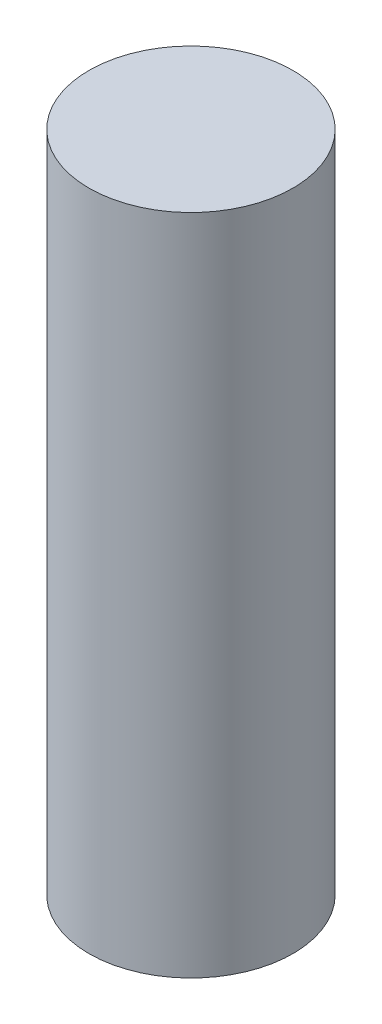
ISO-10303-21;
HEADER;
FILE_DESCRIPTION(('STEP AP214'),'2;1');
FILE_NAME('part.step','',(''),(''),'','','');
FILE_SCHEMA(('AUTOMOTIVE_DESIGN { 1 0 10303 214 1 1 1 1 }'));
ENDSEC;
DATA;
#1=APPLICATION_CONTEXT('core data for automotive mechanical design processes');
#2=APPLICATION_PROTOCOL_DEFINITION('international standard','automotive_design',2000,#1);
#3=PRODUCT_CONTEXT('',#1,'mechanical');
#4=PRODUCT('Part','Part','',(#3));
#5=PRODUCT_RELATED_PRODUCT_CATEGORY('part','',(#4));
#6=PRODUCT_DEFINITION_FORMATION('','',#4);
#7=PRODUCT_DEFINITION_CONTEXT('part definition',#1,'design');
#8=PRODUCT_DEFINITION('design','',#6,#7);
#9=PRODUCT_DEFINITION_SHAPE('','',#8);
#10=(LENGTH_UNIT() NAMED_UNIT(*) SI_UNIT(.MILLI.,.METRE.));
#11=(NAMED_UNIT(*) PLANE_ANGLE_UNIT() SI_UNIT($,.RADIAN.));
#12=(NAMED_UNIT(*) SI_UNIT($,.STERADIAN.) SOLID_ANGLE_UNIT());
#13=UNCERTAINTY_MEASURE_WITH_UNIT(LENGTH_MEASURE(1.E-05),#10,'distance_accuracy_value','');
#14=(GEOMETRIC_REPRESENTATION_CONTEXT(3) GLOBAL_UNCERTAINTY_ASSIGNED_CONTEXT((#13)) GLOBAL_UNIT_ASSIGNED_CONTEXT((#10,
#11,#12)) REPRESENTATION_CONTEXT('',''));
#15=CARTESIAN_POINT('',(0.,0.,0.));
#16=DIRECTION('',(0.,0.,1.));
#17=DIRECTION('',(1.,0.,0.));
#18=AXIS2_PLACEMENT_3D('',#15,#16,#17);
#19=CARTESIAN_POINT('',(0.,284.375,0.));
#20=DIRECTION('',(0.,-1.,0.));
#21=DIRECTION('',(0.,0.,-1.));
#22=AXIS2_PLACEMENT_3D('',#19,#20,#21);
#23=CYLINDRICAL_SURFACE('',#22,37.5);
#24=CARTESIAN_POINT('',(0.,284.375,0.));
#25=DIRECTION('',(0.,1.,0.));
#26=DIRECTION('',(0.,0.,1.));
#27=AXIS2_PLACEMENT_3D('',#24,#25,#26);
#28=CIRCLE('',#27,37.5);
#29=CARTESIAN_POINT('',(0.,284.375,37.5));
#30=VERTEX_POINT('',#29);
#31=EDGE_CURVE('E11',#30,#30,#28,.T.);
#32=ORIENTED_EDGE('',*,*,#31,.F.);
#33=EDGE_LOOP('',(#32));
#34=FACE_BOUND('',#33,.T.);
#35=CARTESIAN_POINT('',(0.,40.625,0.));
#36=DIRECTION('',(0.,1.,0.));
#37=DIRECTION('',(0.,0.,1.));
#38=AXIS2_PLACEMENT_3D('',#35,#36,#37);
#39=CIRCLE('',#38,37.5);
#40=CARTESIAN_POINT('',(0.,40.625,37.5));
#41=VERTEX_POINT('',#40);
#42=EDGE_CURVE('E47',#41,#41,#39,.T.);
#43=ORIENTED_EDGE('',*,*,#42,.T.);
#44=EDGE_LOOP('',(#43));
#45=FACE_BOUND('',#44,.T.);
#46=ADVANCED_FACE('F46',(#34,#45),#23,.T.);
#47=CARTESIAN_POINT('',(0.,284.375,0.));
#48=DIRECTION('',(0.,1.,0.));
#49=DIRECTION('',(0.,0.,1.));
#50=AXIS2_PLACEMENT_3D('',#47,#48,#49);
#51=PLANE('',#50);
#52=ORIENTED_EDGE('',*,*,#31,.T.);
#53=EDGE_LOOP('',(#52));
#54=FACE_BOUND('',#53,.T.);
#55=ADVANCED_FACE('F62',(#54),#51,.T.);
#56=CARTESIAN_POINT('',(0.,40.625,0.));
#57=DIRECTION('',(0.,1.,0.));
#58=DIRECTION('',(0.,0.,1.));
#59=AXIS2_PLACEMENT_3D('',#56,#57,#58);
#60=PLANE('',#59);
#61=ORIENTED_EDGE('',*,*,#42,.F.);
#62=EDGE_LOOP('',(#61));
#63=FACE_BOUND('',#62,.T.);
#64=ADVANCED_FACE('F56',(#63),#60,.F.);
#65=CLOSED_SHELL('',(#46,#55,#64));
#66=MANIFOLD_SOLID_BREP('B2',#65);
#67=ADVANCED_BREP_SHAPE_REPRESENTATION('',(#18,#66),#14);
#68=SHAPE_DEFINITION_REPRESENTATION(#9,#67);
ENDSEC;
END-ISO-10303-21;
